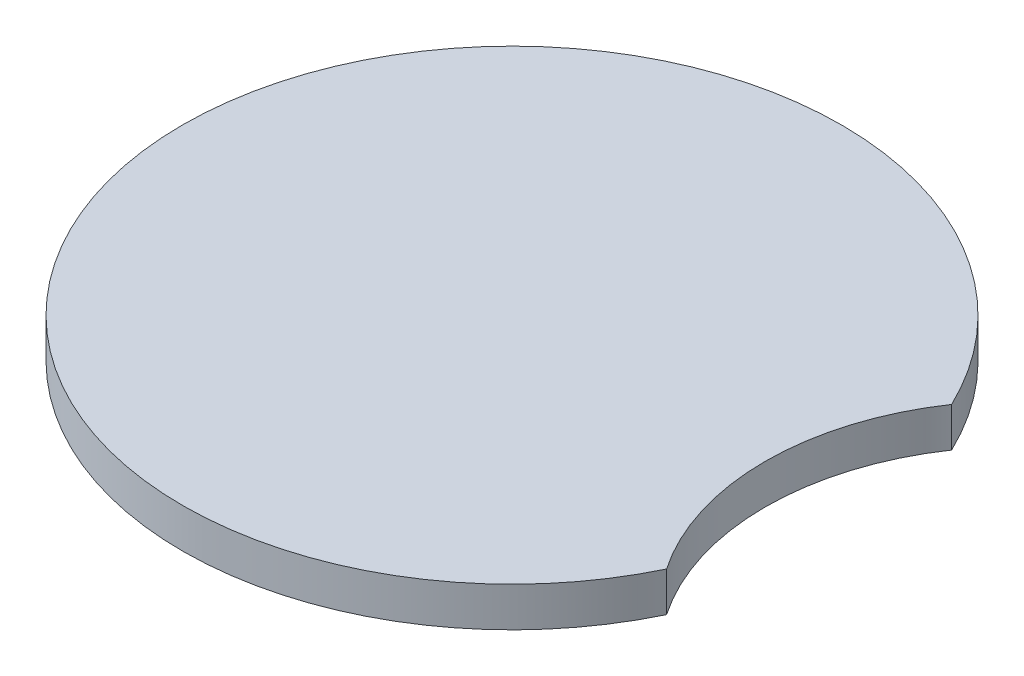
ISO-10303-21;
HEADER;
FILE_DESCRIPTION(('STEP AP214'),'2;1');
FILE_NAME('part.step','',(''),(''),'','','');
FILE_SCHEMA(('AUTOMOTIVE_DESIGN { 1 0 10303 214 1 1 1 1 }'));
ENDSEC;
DATA;
#1=APPLICATION_CONTEXT('core data for automotive mechanical design processes');
#2=APPLICATION_PROTOCOL_DEFINITION('international standard','automotive_design',2000,#1);
#3=PRODUCT_CONTEXT('',#1,'mechanical');
#4=PRODUCT('Part','Part','',(#3));
#5=PRODUCT_RELATED_PRODUCT_CATEGORY('part','',(#4));
#6=PRODUCT_DEFINITION_FORMATION('','',#4);
#7=PRODUCT_DEFINITION_CONTEXT('part definition',#1,'design');
#8=PRODUCT_DEFINITION('design','',#6,#7);
#9=PRODUCT_DEFINITION_SHAPE('','',#8);
#10=(LENGTH_UNIT() NAMED_UNIT(*) SI_UNIT(.MILLI.,.METRE.));
#11=(NAMED_UNIT(*) PLANE_ANGLE_UNIT() SI_UNIT($,.RADIAN.));
#12=(NAMED_UNIT(*) SI_UNIT($,.STERADIAN.) SOLID_ANGLE_UNIT());
#13=UNCERTAINTY_MEASURE_WITH_UNIT(LENGTH_MEASURE(1.E-05),#10,'distance_accuracy_value','');
#14=(GEOMETRIC_REPRESENTATION_CONTEXT(3) GLOBAL_UNCERTAINTY_ASSIGNED_CONTEXT((#13)) GLOBAL_UNIT_ASSIGNED_CONTEXT((#10,
#11,#12)) REPRESENTATION_CONTEXT('',''));
#15=CARTESIAN_POINT('',(0.,0.,0.));
#16=DIRECTION('',(0.,0.,1.));
#17=DIRECTION('',(1.,0.,0.));
#18=AXIS2_PLACEMENT_3D('',#15,#16,#17);
#19=CARTESIAN_POINT('',(38.4132057326246,3.,0.));
#20=DIRECTION('',(0.,-1.,0.));
#21=DIRECTION('',(0.,0.,-1.));
#22=AXIS2_PLACEMENT_3D('',#19,#20,#21);
#23=CYLINDRICAL_SURFACE('',#22,19.2066028663123);
#24=CARTESIAN_POINT('',(38.4132057326246,0.,0.));
#25=DIRECTION('',(0.,-1.,0.));
#26=DIRECTION('',(0.,0.,1.));
#27=AXIS2_PLACEMENT_3D('',#24,#25,#26);
#28=CIRCLE('',#27,19.2066028663123);
#29=CARTESIAN_POINT('',(22.5401752856307,0.,10.813902999983));
#30=VERTEX_POINT('',#29);
#31=CARTESIAN_POINT('',(22.5401752856307,0.,-10.813902999983));
#32=VERTEX_POINT('',#31);
#33=EDGE_CURVE('E64',#30,#32,#28,.T.);
#34=ORIENTED_EDGE('',*,*,#33,.T.);
#35=DIRECTION('',(0.,-1.,0.));
#36=VECTOR('',#35,1.);
#37=CARTESIAN_POINT('',(22.5401752856307,3.,-10.813902999983));
#38=LINE('',#37,#36);
#39=CARTESIAN_POINT('',(22.5401752856307,3.,-10.813902999983));
#40=VERTEX_POINT('',#39);
#41=EDGE_CURVE('E11',#40,#32,#38,.T.);
#42=ORIENTED_EDGE('',*,*,#41,.F.);
#43=CARTESIAN_POINT('',(38.4132057326246,3.,0.));
#44=DIRECTION('',(0.,-1.,0.));
#45=DIRECTION('',(0.,0.,1.));
#46=AXIS2_PLACEMENT_3D('',#43,#44,#45);
#47=CIRCLE('',#46,19.2066028663123);
#48=CARTESIAN_POINT('',(22.5401752856307,3.,10.813902999983));
#49=VERTEX_POINT('',#48);
#50=EDGE_CURVE('E63',#49,#40,#47,.T.);
#51=ORIENTED_EDGE('',*,*,#50,.F.);
#52=DIRECTION('',(0.,-1.,0.));
#53=VECTOR('',#52,1.);
#54=CARTESIAN_POINT('',(22.5401752856307,3.,10.813902999983));
#55=LINE('',#54,#53);
#56=EDGE_CURVE('E41',#49,#30,#55,.T.);
#57=ORIENTED_EDGE('',*,*,#56,.T.);
#58=EDGE_LOOP('',(#34,#42,#51,#57));
#59=FACE_BOUND('',#58,.T.);
#60=ADVANCED_FACE('F33',(#59),#23,.F.);
#61=CARTESIAN_POINT('',(0.,3.,0.));
#62=DIRECTION('',(0.,-1.,0.));
#63=DIRECTION('',(0.,0.,-1.));
#64=AXIS2_PLACEMENT_3D('',#61,#62,#63);
#65=CYLINDRICAL_SURFACE('',#64,25.);
#66=CARTESIAN_POINT('',(0.,0.,0.));
#67=DIRECTION('',(0.,1.,0.));
#68=DIRECTION('',(0.,0.,1.));
#69=AXIS2_PLACEMENT_3D('',#66,#67,#68);
#70=CIRCLE('',#69,25.);
#71=EDGE_CURVE('E56',#32,#30,#70,.T.);
#72=ORIENTED_EDGE('',*,*,#71,.T.);
#73=ORIENTED_EDGE('',*,*,#56,.F.);
#74=CARTESIAN_POINT('',(0.,3.,0.));
#75=DIRECTION('',(0.,1.,0.));
#76=DIRECTION('',(0.,0.,1.));
#77=AXIS2_PLACEMENT_3D('',#74,#75,#76);
#78=CIRCLE('',#77,25.);
#79=EDGE_CURVE('E48',#40,#49,#78,.T.);
#80=ORIENTED_EDGE('',*,*,#79,.F.);
#81=ORIENTED_EDGE('',*,*,#41,.T.);
#82=EDGE_LOOP('',(#72,#73,#80,#81));
#83=FACE_BOUND('',#82,.T.);
#84=ADVANCED_FACE('F59',(#83),#65,.T.);
#85=CARTESIAN_POINT('',(19.2066028663123,3.,0.));
#86=DIRECTION('',(0.,1.,0.));
#87=DIRECTION('',(0.,0.,1.));
#88=AXIS2_PLACEMENT_3D('',#85,#86,#87);
#89=PLANE('',#88);
#90=ORIENTED_EDGE('',*,*,#50,.T.);
#91=ORIENTED_EDGE('',*,*,#79,.T.);
#92=EDGE_LOOP('',(#90,#91));
#93=FACE_BOUND('',#92,.T.);
#94=ADVANCED_FACE('F71',(#93),#89,.T.);
#95=CARTESIAN_POINT('',(19.2066028663123,0.,0.));
#96=DIRECTION('',(0.,1.,0.));
#97=DIRECTION('',(0.,0.,1.));
#98=AXIS2_PLACEMENT_3D('',#95,#96,#97);
#99=PLANE('',#98);
#100=ORIENTED_EDGE('',*,*,#33,.F.);
#101=ORIENTED_EDGE('',*,*,#71,.F.);
#102=EDGE_LOOP('',(#100,#101));
#103=FACE_BOUND('',#102,.T.);
#104=ADVANCED_FACE('F67',(#103),#99,.F.);
#105=CLOSED_SHELL('',(#60,#84,#94,#104));
#106=MANIFOLD_SOLID_BREP('B2',#105);
#107=ADVANCED_BREP_SHAPE_REPRESENTATION('',(#18,#106),#14);
#108=SHAPE_DEFINITION_REPRESENTATION(#9,#107);
ENDSEC;
END-ISO-10303-21;
